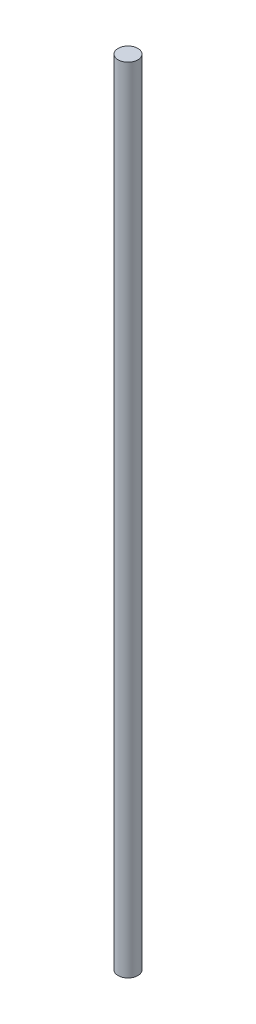
ISO-10303-21;
HEADER;
FILE_DESCRIPTION(('STEP AP214'),'2;1');
FILE_NAME('part.step','',(''),(''),'','','');
FILE_SCHEMA(('AUTOMOTIVE_DESIGN { 1 0 10303 214 1 1 1 1 }'));
ENDSEC;
DATA;
#1=APPLICATION_CONTEXT('core data for automotive mechanical design processes');
#2=APPLICATION_PROTOCOL_DEFINITION('international standard','automotive_design',2000,#1);
#3=PRODUCT_CONTEXT('',#1,'mechanical');
#4=PRODUCT('Part','Part','',(#3));
#5=PRODUCT_RELATED_PRODUCT_CATEGORY('part','',(#4));
#6=PRODUCT_DEFINITION_FORMATION('','',#4);
#7=PRODUCT_DEFINITION_CONTEXT('part definition',#1,'design');
#8=PRODUCT_DEFINITION('design','',#6,#7);
#9=PRODUCT_DEFINITION_SHAPE('','',#8);
#10=(LENGTH_UNIT() NAMED_UNIT(*) SI_UNIT(.MILLI.,.METRE.));
#11=(NAMED_UNIT(*) PLANE_ANGLE_UNIT() SI_UNIT($,.RADIAN.));
#12=(NAMED_UNIT(*) SI_UNIT($,.STERADIAN.) SOLID_ANGLE_UNIT());
#13=UNCERTAINTY_MEASURE_WITH_UNIT(LENGTH_MEASURE(1.E-05),#10,'distance_accuracy_value','');
#14=(GEOMETRIC_REPRESENTATION_CONTEXT(3) GLOBAL_UNCERTAINTY_ASSIGNED_CONTEXT((#13)) GLOBAL_UNIT_ASSIGNED_CONTEXT((#10,
#11,#12)) REPRESENTATION_CONTEXT('',''));
#15=CARTESIAN_POINT('',(0.,0.,0.));
#16=DIRECTION('',(0.,0.,1.));
#17=DIRECTION('',(1.,0.,0.));
#18=AXIS2_PLACEMENT_3D('',#15,#16,#17);
#19=CARTESIAN_POINT('',(0.,254.,0.));
#20=DIRECTION('',(0.,-1.,0.));
#21=DIRECTION('',(0.,0.,-1.));
#22=AXIS2_PLACEMENT_3D('',#19,#20,#21);
#23=CYLINDRICAL_SURFACE('',#22,3.175);
#24=CARTESIAN_POINT('',(0.,254.,0.));
#25=DIRECTION('',(0.,1.,0.));
#26=DIRECTION('',(0.,0.,1.));
#27=AXIS2_PLACEMENT_3D('',#24,#25,#26);
#28=CIRCLE('',#27,3.175);
#29=CARTESIAN_POINT('',(0.,254.,3.175));
#30=VERTEX_POINT('',#29);
#31=EDGE_CURVE('E10',#30,#30,#28,.T.);
#32=ORIENTED_EDGE('',*,*,#31,.F.);
#33=EDGE_LOOP('',(#32));
#34=FACE_BOUND('',#33,.T.);
#35=CARTESIAN_POINT('',(0.,0.,0.));
#36=DIRECTION('',(0.,1.,0.));
#37=DIRECTION('',(0.,0.,1.));
#38=AXIS2_PLACEMENT_3D('',#35,#36,#37);
#39=CIRCLE('',#38,3.175);
#40=CARTESIAN_POINT('',(0.,0.,3.175));
#41=VERTEX_POINT('',#40);
#42=EDGE_CURVE('E40',#41,#41,#39,.T.);
#43=ORIENTED_EDGE('',*,*,#42,.T.);
#44=EDGE_LOOP('',(#43));
#45=FACE_BOUND('',#44,.T.);
#46=ADVANCED_FACE('F37',(#34,#45),#23,.T.);
#47=CARTESIAN_POINT('',(0.,254.,0.));
#48=DIRECTION('',(0.,1.,0.));
#49=DIRECTION('',(0.,0.,1.));
#50=AXIS2_PLACEMENT_3D('',#47,#48,#49);
#51=PLANE('',#50);
#52=ORIENTED_EDGE('',*,*,#31,.T.);
#53=EDGE_LOOP('',(#52));
#54=FACE_BOUND('',#53,.T.);
#55=ADVANCED_FACE('F54',(#54),#51,.T.);
#56=CARTESIAN_POINT('',(0.,0.,0.));
#57=DIRECTION('',(0.,1.,0.));
#58=DIRECTION('',(0.,0.,1.));
#59=AXIS2_PLACEMENT_3D('',#56,#57,#58);
#60=PLANE('',#59);
#61=ORIENTED_EDGE('',*,*,#42,.F.);
#62=EDGE_LOOP('',(#61));
#63=FACE_BOUND('',#62,.T.);
#64=ADVANCED_FACE('F52',(#63),#60,.F.);
#65=CLOSED_SHELL('',(#46,#55,#64));
#66=MANIFOLD_SOLID_BREP('B2',#65);
#67=ADVANCED_BREP_SHAPE_REPRESENTATION('',(#18,#66),#14);
#68=SHAPE_DEFINITION_REPRESENTATION(#9,#67);
ENDSEC;
END-ISO-10303-21;
